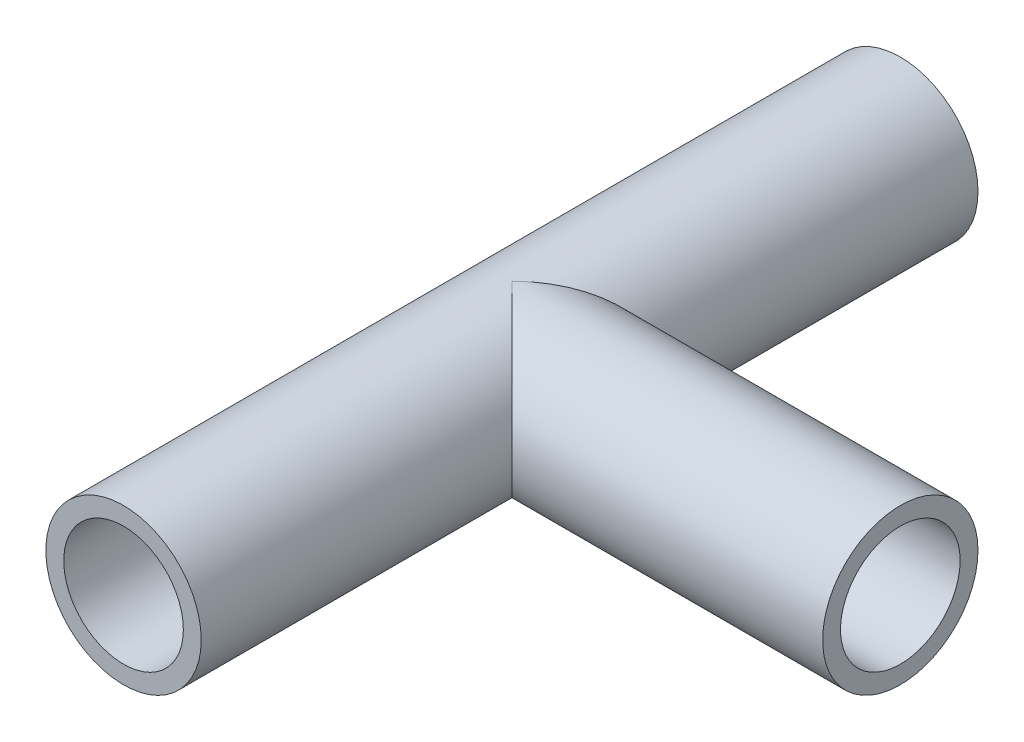
ISO-10303-21;
HEADER;
FILE_DESCRIPTION(('STEP AP214'),'2;1');
FILE_NAME('part.step','',(''),(''),'','','');
FILE_SCHEMA(('AUTOMOTIVE_DESIGN { 1 0 10303 214 1 1 1 1 }'));
ENDSEC;
DATA;
#1=APPLICATION_CONTEXT('core data for automotive mechanical design processes');
#2=APPLICATION_PROTOCOL_DEFINITION('international standard','automotive_design',2000,#1);
#3=PRODUCT_CONTEXT('',#1,'mechanical');
#4=PRODUCT('Part','Part','',(#3));
#5=PRODUCT_RELATED_PRODUCT_CATEGORY('part','',(#4));
#6=PRODUCT_DEFINITION_FORMATION('','',#4);
#7=PRODUCT_DEFINITION_CONTEXT('part definition',#1,'design');
#8=PRODUCT_DEFINITION('design','',#6,#7);
#9=PRODUCT_DEFINITION_SHAPE('','',#8);
#10=(LENGTH_UNIT() NAMED_UNIT(*) SI_UNIT(.MILLI.,.METRE.));
#11=(NAMED_UNIT(*) PLANE_ANGLE_UNIT() SI_UNIT($,.RADIAN.));
#12=(NAMED_UNIT(*) SI_UNIT($,.STERADIAN.) SOLID_ANGLE_UNIT());
#13=UNCERTAINTY_MEASURE_WITH_UNIT(LENGTH_MEASURE(1.E-05),#10,'distance_accuracy_value','');
#14=(GEOMETRIC_REPRESENTATION_CONTEXT(3) GLOBAL_UNCERTAINTY_ASSIGNED_CONTEXT((#13)) GLOBAL_UNIT_ASSIGNED_CONTEXT((#10,
#11,#12)) REPRESENTATION_CONTEXT('',''));
#15=CARTESIAN_POINT('',(0.,0.,0.));
#16=DIRECTION('',(0.,0.,1.));
#17=DIRECTION('',(1.,0.,0.));
#18=AXIS2_PLACEMENT_3D('',#15,#16,#17);
#19=CARTESIAN_POINT('',(0.,0.,100.));
#20=DIRECTION('',(0.,0.,-1.));
#21=DIRECTION('',(-1.,0.,0.));
#22=AXIS2_PLACEMENT_3D('',#19,#20,#21);
#23=CYLINDRICAL_SURFACE('',#22,10.);
#24=CARTESIAN_POINT('',(0.,0.,0.));
#25=DIRECTION('',(0.,0.,1.));
#26=DIRECTION('',(1.,0.,0.));
#27=AXIS2_PLACEMENT_3D('',#24,#25,#26);
#28=CIRCLE('',#27,10.);
#29=CARTESIAN_POINT('',(10.,0.,0.));
#30=VERTEX_POINT('',#29);
#31=EDGE_CURVE('E90',#30,#30,#28,.T.);
#32=ORIENTED_EDGE('',*,*,#31,.T.);
#33=EDGE_LOOP('',(#32));
#34=FACE_BOUND('',#33,.T.);
#35=CARTESIAN_POINT('',(0.,0.,100.));
#36=DIRECTION('',(0.,0.,1.));
#37=DIRECTION('',(1.,0.,0.));
#38=AXIS2_PLACEMENT_3D('',#35,#36,#37);
#39=CIRCLE('',#38,10.);
#40=CARTESIAN_POINT('',(10.,0.,100.));
#41=VERTEX_POINT('',#40);
#42=EDGE_CURVE('E91',#41,#41,#39,.T.);
#43=ORIENTED_EDGE('',*,*,#42,.F.);
#44=EDGE_LOOP('',(#43));
#45=FACE_BOUND('',#44,.T.);
#46=CARTESIAN_POINT('',(0.,0.,50.));
#47=DIRECTION('',(-0.707106781186548,0.,-0.707106781186547));
#48=DIRECTION('',(0.707106781186548,0.,-0.707106781186547));
#49=AXIS2_PLACEMENT_3D('',#46,#47,#48);
#50=ELLIPSE('',#49,14.1421356237309,10.);
#51=CARTESIAN_POINT('',(0.,-9.99999999999999,50.));
#52=VERTEX_POINT('',#51);
#53=CARTESIAN_POINT('',(0.,10.,50.));
#54=VERTEX_POINT('',#53);
#55=EDGE_CURVE('E11',#52,#54,#50,.F.);
#56=ORIENTED_EDGE('',*,*,#55,.F.);
#57=CARTESIAN_POINT('',(0.,0.,50.));
#58=DIRECTION('',(0.707106781186548,0.,-0.707106781186547));
#59=DIRECTION('',(-0.707106781186548,0.,-0.707106781186547));
#60=AXIS2_PLACEMENT_3D('',#57,#58,#59);
#61=ELLIPSE('',#60,14.1421356237309,10.);
#62=EDGE_CURVE('E49',#54,#52,#61,.T.);
#63=ORIENTED_EDGE('',*,*,#62,.F.);
#64=EDGE_LOOP('',(#56,#63));
#65=FACE_BOUND('',#64,.T.);
#66=ADVANCED_FACE('F41',(#34,#45,#65),#23,.T.);
#67=CARTESIAN_POINT('',(0.,0.,100.));
#68=DIRECTION('',(0.,0.,1.));
#69=DIRECTION('',(1.,0.,0.));
#70=AXIS2_PLACEMENT_3D('',#67,#68,#69);
#71=PLANE('',#70);
#72=CARTESIAN_POINT('',(0.,0.,100.));
#73=DIRECTION('',(0.,0.,1.));
#74=DIRECTION('',(1.,0.,0.));
#75=AXIS2_PLACEMENT_3D('',#72,#73,#74);
#76=CIRCLE('',#75,7.7);
#77=CARTESIAN_POINT('',(7.7,0.,100.));
#78=VERTEX_POINT('',#77);
#79=EDGE_CURVE('E73',#78,#78,#76,.T.);
#80=ORIENTED_EDGE('',*,*,#79,.F.);
#81=EDGE_LOOP('',(#80));
#82=FACE_BOUND('',#81,.T.);
#83=ORIENTED_EDGE('',*,*,#42,.T.);
#84=EDGE_LOOP('',(#83));
#85=FACE_BOUND('',#84,.T.);
#86=ADVANCED_FACE('F111',(#82,#85),#71,.T.);
#87=CARTESIAN_POINT('',(0.,0.,0.));
#88=DIRECTION('',(0.,0.,1.));
#89=DIRECTION('',(1.,0.,0.));
#90=AXIS2_PLACEMENT_3D('',#87,#88,#89);
#91=PLANE('',#90);
#92=CARTESIAN_POINT('',(0.,0.,0.));
#93=DIRECTION('',(0.,0.,1.));
#94=DIRECTION('',(1.,0.,0.));
#95=AXIS2_PLACEMENT_3D('',#92,#93,#94);
#96=CIRCLE('',#95,7.7);
#97=CARTESIAN_POINT('',(7.7,0.,0.));
#98=VERTEX_POINT('',#97);
#99=EDGE_CURVE('E77',#98,#98,#96,.T.);
#100=ORIENTED_EDGE('',*,*,#99,.T.);
#101=EDGE_LOOP('',(#100));
#102=FACE_BOUND('',#101,.T.);
#103=ORIENTED_EDGE('',*,*,#31,.F.);
#104=EDGE_LOOP('',(#103));
#105=FACE_BOUND('',#104,.T.);
#106=ADVANCED_FACE('F102',(#102,#105),#91,.F.);
#107=CARTESIAN_POINT('',(50.,0.,50.));
#108=DIRECTION('',(-1.,0.,0.));
#109=DIRECTION('',(0.,0.,1.));
#110=AXIS2_PLACEMENT_3D('',#107,#108,#109);
#111=CYLINDRICAL_SURFACE('',#110,10.);
#112=CARTESIAN_POINT('',(50.,0.,50.));
#113=DIRECTION('',(1.,0.,0.));
#114=DIRECTION('',(0.,0.,-1.));
#115=AXIS2_PLACEMENT_3D('',#112,#113,#114);
#116=CIRCLE('',#115,10.);
#117=CARTESIAN_POINT('',(50.,0.,40.));
#118=VERTEX_POINT('',#117);
#119=EDGE_CURVE('E69',#118,#118,#116,.T.);
#120=ORIENTED_EDGE('',*,*,#119,.F.);
#121=EDGE_LOOP('',(#120));
#122=FACE_BOUND('',#121,.T.);
#123=ORIENTED_EDGE('',*,*,#62,.T.);
#124=ORIENTED_EDGE('',*,*,#55,.T.);
#125=EDGE_LOOP('',(#123,#124));
#126=FACE_BOUND('',#125,.T.);
#127=ADVANCED_FACE('F99',(#122,#126),#111,.T.);
#128=CARTESIAN_POINT('',(50.,0.,50.));
#129=DIRECTION('',(1.,0.,0.));
#130=DIRECTION('',(0.,0.,-1.));
#131=AXIS2_PLACEMENT_3D('',#128,#129,#130);
#132=PLANE('',#131);
#133=CARTESIAN_POINT('',(50.,0.,50.));
#134=DIRECTION('',(1.,0.,0.));
#135=DIRECTION('',(0.,0.,-1.));
#136=AXIS2_PLACEMENT_3D('',#133,#134,#135);
#137=CIRCLE('',#136,7.7);
#138=CARTESIAN_POINT('',(50.,0.,42.3));
#139=VERTEX_POINT('',#138);
#140=EDGE_CURVE('E82',#139,#139,#137,.T.);
#141=ORIENTED_EDGE('',*,*,#140,.F.);
#142=EDGE_LOOP('',(#141));
#143=FACE_BOUND('',#142,.T.);
#144=ORIENTED_EDGE('',*,*,#119,.T.);
#145=EDGE_LOOP('',(#144));
#146=FACE_BOUND('',#145,.T.);
#147=ADVANCED_FACE('F101',(#143,#146),#132,.T.);
#148=CARTESIAN_POINT('',(0.,0.,100.));
#149=DIRECTION('',(0.,0.,-1.));
#150=DIRECTION('',(-1.,0.,0.));
#151=AXIS2_PLACEMENT_3D('',#148,#149,#150);
#152=CYLINDRICAL_SURFACE('',#151,7.7);
#153=ORIENTED_EDGE('',*,*,#99,.F.);
#154=EDGE_LOOP('',(#153));
#155=FACE_BOUND('',#154,.T.);
#156=ORIENTED_EDGE('',*,*,#79,.T.);
#157=EDGE_LOOP('',(#156));
#158=FACE_BOUND('',#157,.T.);
#159=CARTESIAN_POINT('',(0.,0.,50.));
#160=DIRECTION('',(-0.707106781186548,0.,-0.707106781186547));
#161=DIRECTION('',(0.707106781186548,0.,-0.707106781186547));
#162=AXIS2_PLACEMENT_3D('',#159,#160,#161);
#163=ELLIPSE('',#162,10.8894444302728,7.7);
#164=CARTESIAN_POINT('',(0.,-7.7,50.));
#165=VERTEX_POINT('',#164);
#166=CARTESIAN_POINT('',(0.,7.7,50.));
#167=VERTEX_POINT('',#166);
#168=EDGE_CURVE('E63',#165,#167,#163,.F.);
#169=ORIENTED_EDGE('',*,*,#168,.T.);
#170=CARTESIAN_POINT('',(0.,0.,50.));
#171=DIRECTION('',(0.707106781186548,0.,-0.707106781186547));
#172=DIRECTION('',(-0.707106781186548,0.,-0.707106781186547));
#173=AXIS2_PLACEMENT_3D('',#170,#171,#172);
#174=ELLIPSE('',#173,10.8894444302728,7.7);
#175=EDGE_CURVE('E66',#167,#165,#174,.T.);
#176=ORIENTED_EDGE('',*,*,#175,.T.);
#177=EDGE_LOOP('',(#169,#176));
#178=FACE_BOUND('',#177,.T.);
#179=ADVANCED_FACE('F71',(#155,#158,#178),#152,.F.);
#180=CARTESIAN_POINT('',(50.,0.,50.));
#181=DIRECTION('',(-1.,0.,0.));
#182=DIRECTION('',(0.,0.,1.));
#183=AXIS2_PLACEMENT_3D('',#180,#181,#182);
#184=CYLINDRICAL_SURFACE('',#183,7.7);
#185=ORIENTED_EDGE('',*,*,#140,.T.);
#186=EDGE_LOOP('',(#185));
#187=FACE_BOUND('',#186,.T.);
#188=ORIENTED_EDGE('',*,*,#175,.F.);
#189=ORIENTED_EDGE('',*,*,#168,.F.);
#190=EDGE_LOOP('',(#188,#189));
#191=FACE_BOUND('',#190,.T.);
#192=ADVANCED_FACE('F65',(#187,#191),#184,.F.);
#193=CLOSED_SHELL('',(#66,#86,#106,#127,#147,#179,#192));
#194=MANIFOLD_SOLID_BREP('B2',#193);
#195=ADVANCED_BREP_SHAPE_REPRESENTATION('',(#18,#194),#14);
#196=SHAPE_DEFINITION_REPRESENTATION(#9,#195);
ENDSEC;
END-ISO-10303-21;
